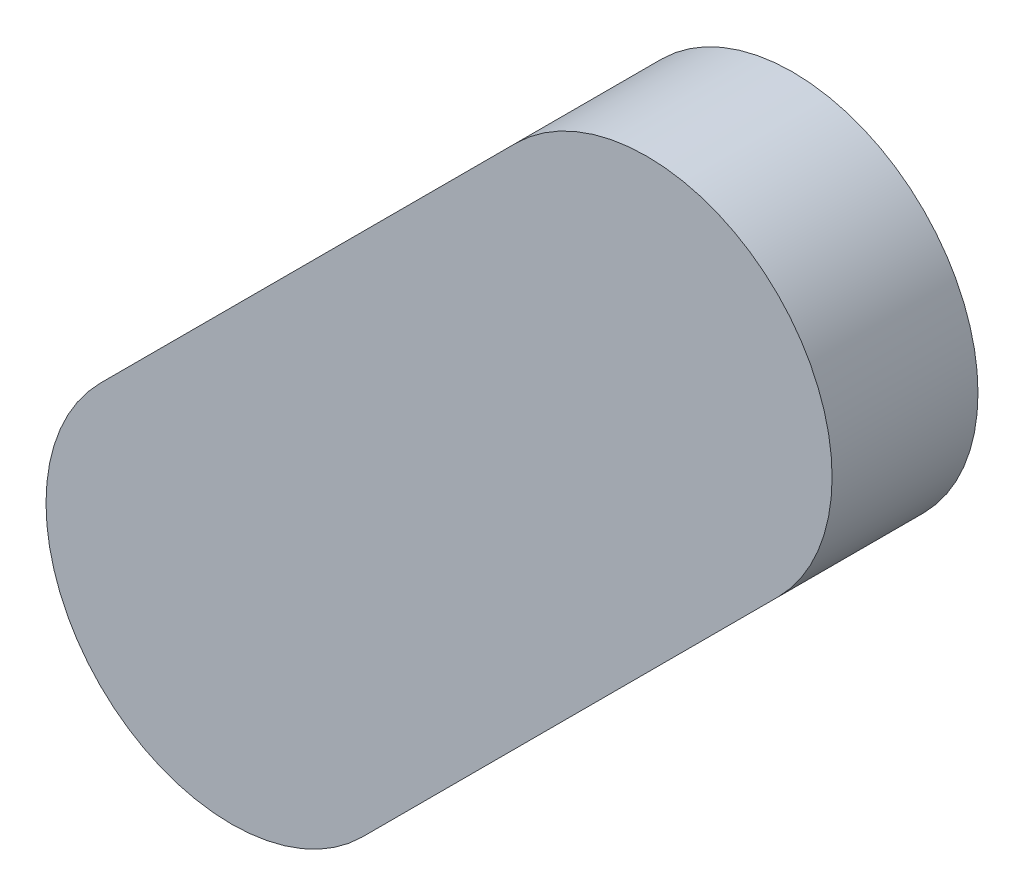
ISO-10303-21;
HEADER;
FILE_DESCRIPTION(('STEP AP214'),'2;1');
FILE_NAME('part.step','',(''),(''),'','','');
FILE_SCHEMA(('AUTOMOTIVE_DESIGN { 1 0 10303 214 1 1 1 1 }'));
ENDSEC;
DATA;
#1=APPLICATION_CONTEXT('core data for automotive mechanical design processes');
#2=APPLICATION_PROTOCOL_DEFINITION('international standard','automotive_design',2000,#1);
#3=PRODUCT_CONTEXT('',#1,'mechanical');
#4=PRODUCT('Part','Part','',(#3));
#5=PRODUCT_RELATED_PRODUCT_CATEGORY('part','',(#4));
#6=PRODUCT_DEFINITION_FORMATION('','',#4);
#7=PRODUCT_DEFINITION_CONTEXT('part definition',#1,'design');
#8=PRODUCT_DEFINITION('design','',#6,#7);
#9=PRODUCT_DEFINITION_SHAPE('','',#8);
#10=(LENGTH_UNIT() NAMED_UNIT(*) SI_UNIT(.MILLI.,.METRE.));
#11=(NAMED_UNIT(*) PLANE_ANGLE_UNIT() SI_UNIT($,.RADIAN.));
#12=(NAMED_UNIT(*) SI_UNIT($,.STERADIAN.) SOLID_ANGLE_UNIT());
#13=UNCERTAINTY_MEASURE_WITH_UNIT(LENGTH_MEASURE(1.E-05),#10,'distance_accuracy_value','');
#14=(GEOMETRIC_REPRESENTATION_CONTEXT(3) GLOBAL_UNCERTAINTY_ASSIGNED_CONTEXT((#13)) GLOBAL_UNIT_ASSIGNED_CONTEXT((#10,
#11,#12)) REPRESENTATION_CONTEXT('',''));
#15=CARTESIAN_POINT('',(0.,0.,0.));
#16=DIRECTION('',(0.,0.,1.));
#17=DIRECTION('',(1.,0.,0.));
#18=AXIS2_PLACEMENT_3D('',#15,#16,#17);
#19=CARTESIAN_POINT('',(95.36797284,66.11439406,0.));
#20=DIRECTION('',(-0.707106781186548,0.707106781186548,0.));
#21=DIRECTION('',(0.707106781186548,0.707106781186548,0.));
#22=AXIS2_PLACEMENT_3D('',#19,#20,#21);
#23=PLANE('',#22);
#24=DIRECTION('',(0.707106781186548,0.707106781186548,0.));
#25=VECTOR('',#24,1.);
#26=CARTESIAN_POINT('',(95.36797284,66.11439406,0.1999996));
#27=LINE('',#26,#25);
#28=CARTESIAN_POINT('',(95.36797284,66.11439406,0.1999996));
#29=VERTEX_POINT('',#28);
#30=CARTESIAN_POINT('',(95.93760594,66.68402716,0.1999996));
#31=VERTEX_POINT('',#30);
#32=EDGE_CURVE('E11',#29,#31,#27,.T.);
#33=ORIENTED_EDGE('',*,*,#32,.F.);
#34=DIRECTION('',(0.,0.,1.));
#35=VECTOR('',#34,1.);
#36=CARTESIAN_POINT('',(95.36797284,66.11439406,0.));
#37=LINE('',#36,#35);
#38=CARTESIAN_POINT('',(95.36797284,66.11439406,0.));
#39=VERTEX_POINT('',#38);
#40=EDGE_CURVE('E24',#39,#29,#37,.T.);
#41=ORIENTED_EDGE('',*,*,#40,.F.);
#42=DIRECTION('',(0.707106781186548,0.707106781186548,0.));
#43=VECTOR('',#42,1.);
#44=CARTESIAN_POINT('',(95.36797284,66.11439406,0.));
#45=LINE('',#44,#43);
#46=CARTESIAN_POINT('',(95.93760594,66.68402716,0.));
#47=VERTEX_POINT('',#46);
#48=EDGE_CURVE('E75',#39,#47,#45,.T.);
#49=ORIENTED_EDGE('',*,*,#48,.T.);
#50=DIRECTION('',(0.,0.,1.));
#51=VECTOR('',#50,1.);
#52=CARTESIAN_POINT('',(95.93760594,66.68402716,0.));
#53=LINE('',#52,#51);
#54=EDGE_CURVE('E37',#47,#31,#53,.T.);
#55=ORIENTED_EDGE('',*,*,#54,.T.);
#56=EDGE_LOOP('',(#33,#41,#49,#55));
#57=FACE_BOUND('',#56,.T.);
#58=ADVANCED_FACE('F17',(#57),#23,.F.);
#59=CARTESIAN_POINT('',(95.75800127,66.86363183,0.));
#60=DIRECTION('',(0.,0.,-1.));
#61=DIRECTION('',(0.707106781186548,-0.707106781186548,0.));
#62=AXIS2_PLACEMENT_3D('',#59,#60,#61);
#63=CYLINDRICAL_SURFACE('',#62,0.253999360179546);
#64=CARTESIAN_POINT('',(95.75800127,66.86363183,0.1999996));
#65=DIRECTION('',(0.,0.,1.));
#66=DIRECTION('',(0.707106781186548,-0.707106781186548,0.));
#67=AXIS2_PLACEMENT_3D('',#64,#65,#66);
#68=CIRCLE('',#67,0.253999360179546);
#69=CARTESIAN_POINT('',(95.5783966,67.0432365,0.1999996));
#70=VERTEX_POINT('',#69);
#71=EDGE_CURVE('E83',#31,#70,#68,.T.);
#72=ORIENTED_EDGE('',*,*,#71,.F.);
#73=ORIENTED_EDGE('',*,*,#54,.F.);
#74=CARTESIAN_POINT('',(95.75800127,66.86363183,0.));
#75=DIRECTION('',(0.,0.,1.));
#76=DIRECTION('',(0.707106781186548,-0.707106781186548,0.));
#77=AXIS2_PLACEMENT_3D('',#74,#75,#76);
#78=CIRCLE('',#77,0.253999360179546);
#79=CARTESIAN_POINT('',(95.5783966,67.0432365,0.));
#80=VERTEX_POINT('',#79);
#81=EDGE_CURVE('E81',#47,#80,#78,.T.);
#82=ORIENTED_EDGE('',*,*,#81,.T.);
#83=DIRECTION('',(0.,0.,1.));
#84=VECTOR('',#83,1.);
#85=CARTESIAN_POINT('',(95.5783966,67.0432365,0.));
#86=LINE('',#85,#84);
#87=EDGE_CURVE('E67',#80,#70,#86,.T.);
#88=ORIENTED_EDGE('',*,*,#87,.T.);
#89=EDGE_LOOP('',(#72,#73,#82,#88));
#90=FACE_BOUND('',#89,.T.);
#91=ADVANCED_FACE('F89',(#90),#63,.T.);
#92=CARTESIAN_POINT('',(95.5783966,67.0432365,0.));
#93=DIRECTION('',(0.707106781186548,-0.707106781186548,0.));
#94=DIRECTION('',(-0.707106781186548,-0.707106781186548,0.));
#95=AXIS2_PLACEMENT_3D('',#92,#93,#94);
#96=PLANE('',#95);
#97=DIRECTION('',(-0.707106781186548,-0.707106781186548,0.));
#98=VECTOR('',#97,1.);
#99=CARTESIAN_POINT('',(95.5783966,67.0432365,0.1999996));
#100=LINE('',#99,#98);
#101=CARTESIAN_POINT('',(95.0087635,66.4736034,0.1999996));
#102=VERTEX_POINT('',#101);
#103=EDGE_CURVE('E71',#70,#102,#100,.T.);
#104=ORIENTED_EDGE('',*,*,#103,.F.);
#105=ORIENTED_EDGE('',*,*,#87,.F.);
#106=DIRECTION('',(-0.707106781186548,-0.707106781186548,0.));
#107=VECTOR('',#106,1.);
#108=CARTESIAN_POINT('',(95.5783966,67.0432365,0.));
#109=LINE('',#108,#107);
#110=CARTESIAN_POINT('',(95.0087635,66.4736034,0.));
#111=VERTEX_POINT('',#110);
#112=EDGE_CURVE('E63',#80,#111,#109,.T.);
#113=ORIENTED_EDGE('',*,*,#112,.T.);
#114=DIRECTION('',(0.,0.,1.));
#115=VECTOR('',#114,1.);
#116=CARTESIAN_POINT('',(95.0087635,66.4736034,0.));
#117=LINE('',#116,#115);
#118=EDGE_CURVE('E53',#111,#102,#117,.T.);
#119=ORIENTED_EDGE('',*,*,#118,.T.);
#120=EDGE_LOOP('',(#104,#105,#113,#119));
#121=FACE_BOUND('',#120,.T.);
#122=ADVANCED_FACE('F66',(#121),#96,.F.);
#123=CARTESIAN_POINT('',(95.18836817,66.29399873,0.));
#124=DIRECTION('',(0.,0.,-1.));
#125=DIRECTION('',(-0.70710678118652,0.707106781186576,0.));
#126=AXIS2_PLACEMENT_3D('',#123,#124,#125);
#127=CYLINDRICAL_SURFACE('',#126,0.253999360179542);
#128=CARTESIAN_POINT('',(95.18836817,66.29399873,0.1999996));
#129=DIRECTION('',(0.,0.,1.));
#130=DIRECTION('',(-0.70710678118652,0.707106781186576,0.));
#131=AXIS2_PLACEMENT_3D('',#128,#129,#130);
#132=CIRCLE('',#131,0.253999360179542);
#133=EDGE_CURVE('E59',#102,#29,#132,.T.);
#134=ORIENTED_EDGE('',*,*,#133,.F.);
#135=ORIENTED_EDGE('',*,*,#118,.F.);
#136=CARTESIAN_POINT('',(95.18836817,66.29399873,0.));
#137=DIRECTION('',(0.,0.,1.));
#138=DIRECTION('',(-0.70710678118652,0.707106781186576,0.));
#139=AXIS2_PLACEMENT_3D('',#136,#137,#138);
#140=CIRCLE('',#139,0.253999360179542);
#141=EDGE_CURVE('E57',#111,#39,#140,.T.);
#142=ORIENTED_EDGE('',*,*,#141,.T.);
#143=ORIENTED_EDGE('',*,*,#40,.T.);
#144=EDGE_LOOP('',(#134,#135,#142,#143));
#145=FACE_BOUND('',#144,.T.);
#146=ADVANCED_FACE('F55',(#145),#127,.T.);
#147=CARTESIAN_POINT('',(95.36797284,66.11439406,0.));
#148=DIRECTION('',(0.,0.,-1.));
#149=DIRECTION('',(-1.,0.,0.));
#150=AXIS2_PLACEMENT_3D('',#147,#148,#149);
#151=PLANE('',#150);
#152=ORIENTED_EDGE('',*,*,#141,.F.);
#153=ORIENTED_EDGE('',*,*,#112,.F.);
#154=ORIENTED_EDGE('',*,*,#81,.F.);
#155=ORIENTED_EDGE('',*,*,#48,.F.);
#156=EDGE_LOOP('',(#152,#153,#154,#155));
#157=FACE_BOUND('',#156,.T.);
#158=ADVANCED_FACE('F74',(#157),#151,.T.);
#159=CARTESIAN_POINT('',(95.36797284,66.11439406,0.1999996));
#160=DIRECTION('',(0.,0.,-1.));
#161=DIRECTION('',(-1.,0.,0.));
#162=AXIS2_PLACEMENT_3D('',#159,#160,#161);
#163=PLANE('',#162);
#164=ORIENTED_EDGE('',*,*,#32,.T.);
#165=ORIENTED_EDGE('',*,*,#71,.T.);
#166=ORIENTED_EDGE('',*,*,#103,.T.);
#167=ORIENTED_EDGE('',*,*,#133,.T.);
#168=EDGE_LOOP('',(#164,#165,#166,#167));
#169=FACE_BOUND('',#168,.T.);
#170=ADVANCED_FACE('F91',(#169),#163,.F.);
#171=CLOSED_SHELL('',(#58,#91,#122,#146,#158,#170));
#172=MANIFOLD_SOLID_BREP('B1',#171);
#173=ADVANCED_BREP_SHAPE_REPRESENTATION('',(#18,#172),#14);
#174=SHAPE_DEFINITION_REPRESENTATION(#9,#173);
ENDSEC;
END-ISO-10303-21;
